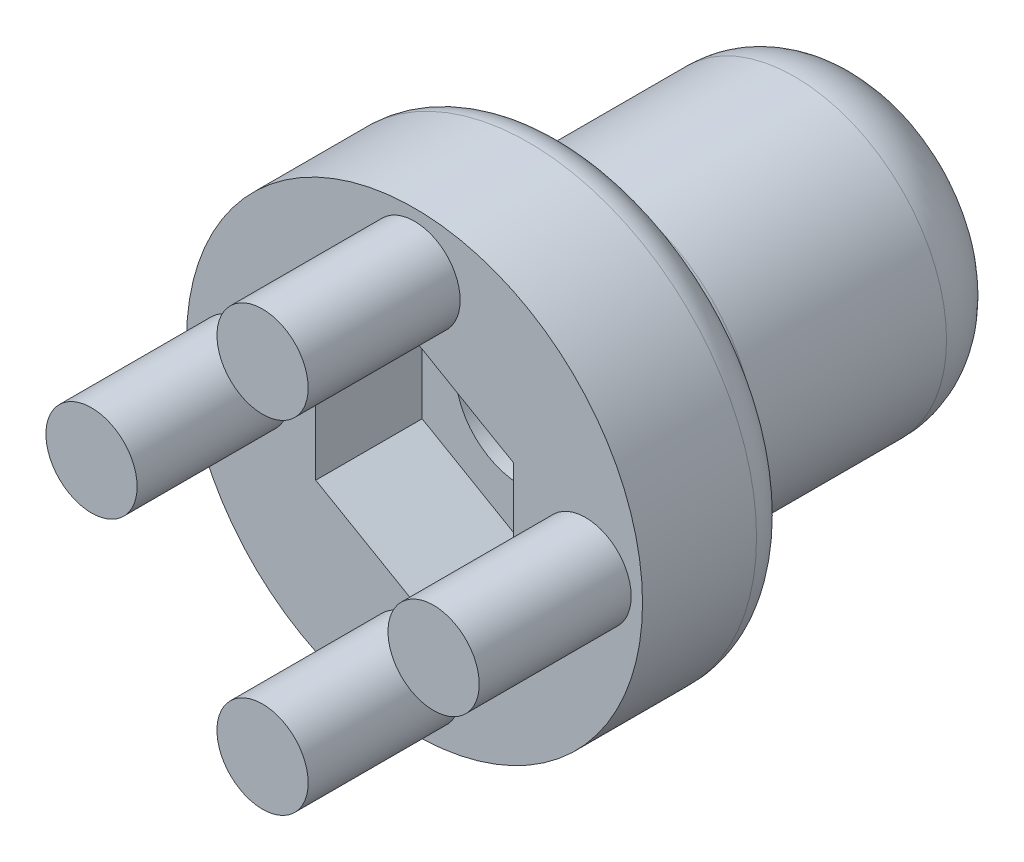
ISO-10303-21;
HEADER;
FILE_DESCRIPTION(('STEP AP214'),'2;1');
FILE_NAME('part.step','',(''),(''),'','','');
FILE_SCHEMA(('AUTOMOTIVE_DESIGN { 1 0 10303 214 1 1 1 1 }'));
ENDSEC;
DATA;
#1=APPLICATION_CONTEXT('core data for automotive mechanical design processes');
#2=APPLICATION_PROTOCOL_DEFINITION('international standard','automotive_design',2000,#1);
#3=PRODUCT_CONTEXT('',#1,'mechanical');
#4=PRODUCT('Part','Part','',(#3));
#5=PRODUCT_RELATED_PRODUCT_CATEGORY('part','',(#4));
#6=PRODUCT_DEFINITION_FORMATION('','',#4);
#7=PRODUCT_DEFINITION_CONTEXT('part definition',#1,'design');
#8=PRODUCT_DEFINITION('design','',#6,#7);
#9=PRODUCT_DEFINITION_SHAPE('','',#8);
#10=(LENGTH_UNIT() NAMED_UNIT(*) SI_UNIT(.MILLI.,.METRE.));
#11=(NAMED_UNIT(*) PLANE_ANGLE_UNIT() SI_UNIT($,.RADIAN.));
#12=(NAMED_UNIT(*) SI_UNIT($,.STERADIAN.) SOLID_ANGLE_UNIT());
#13=UNCERTAINTY_MEASURE_WITH_UNIT(LENGTH_MEASURE(1.E-05),#10,'distance_accuracy_value','');
#14=(GEOMETRIC_REPRESENTATION_CONTEXT(3) GLOBAL_UNCERTAINTY_ASSIGNED_CONTEXT((#13)) GLOBAL_UNIT_ASSIGNED_CONTEXT((#10,
#11,#12)) REPRESENTATION_CONTEXT('',''));
#15=CARTESIAN_POINT('',(0.,0.,0.));
#16=DIRECTION('',(0.,0.,1.));
#17=DIRECTION('',(1.,0.,0.));
#18=AXIS2_PLACEMENT_3D('',#15,#16,#17);
#19=CARTESIAN_POINT('',(0.,0.,30.));
#20=DIRECTION('',(0.,0.,-1.));
#21=DIRECTION('',(-1.,0.,0.));
#22=AXIS2_PLACEMENT_3D('',#19,#20,#21);
#23=CYLINDRICAL_SURFACE('',#22,10.);
#24=CARTESIAN_POINT('',(0.,0.,5.));
#25=DIRECTION('',(0.,0.,1.));
#26=DIRECTION('',(1.,0.,0.));
#27=AXIS2_PLACEMENT_3D('',#24,#25,#26);
#28=CIRCLE('',#27,10.);
#29=CARTESIAN_POINT('',(10.,0.,5.));
#30=VERTEX_POINT('',#29);
#31=EDGE_CURVE('E48',#30,#30,#28,.T.);
#32=ORIENTED_EDGE('',*,*,#31,.T.);
#33=EDGE_LOOP('',(#32));
#34=FACE_BOUND('',#33,.T.);
#35=CARTESIAN_POINT('',(0.,0.,17.5));
#36=DIRECTION('',(0.,0.,1.));
#37=DIRECTION('',(1.,0.,0.));
#38=AXIS2_PLACEMENT_3D('',#35,#36,#37);
#39=CIRCLE('',#38,10.);
#40=CARTESIAN_POINT('',(10.,0.,17.5));
#41=VERTEX_POINT('',#40);
#42=EDGE_CURVE('E157',#41,#41,#39,.F.);
#43=ORIENTED_EDGE('',*,*,#42,.T.);
#44=EDGE_LOOP('',(#43));
#45=FACE_BOUND('',#44,.T.);
#46=ADVANCED_FACE('F40',(#34,#45),#23,.T.);
#47=CARTESIAN_POINT('',(0.,0.,30.));
#48=DIRECTION('',(0.,0.,-1.));
#49=DIRECTION('',(-1.,0.,0.));
#50=AXIS2_PLACEMENT_3D('',#47,#48,#49);
#51=CYLINDRICAL_SURFACE('',#50,4.3);
#52=CARTESIAN_POINT('',(0.,0.,0.));
#53=DIRECTION('',(0.,0.,1.));
#54=DIRECTION('',(1.,0.,0.));
#55=AXIS2_PLACEMENT_3D('',#52,#53,#54);
#56=CIRCLE('',#55,4.3);
#57=CARTESIAN_POINT('',(4.3,0.,0.));
#58=VERTEX_POINT('',#57);
#59=EDGE_CURVE('E149',#58,#58,#56,.T.);
#60=ORIENTED_EDGE('',*,*,#59,.F.);
#61=EDGE_LOOP('',(#60));
#62=FACE_BOUND('',#61,.T.);
#63=CARTESIAN_POINT('',(0.,0.,23.));
#64=DIRECTION('',(0.,0.,1.));
#65=DIRECTION('',(1.,0.,0.));
#66=AXIS2_PLACEMENT_3D('',#63,#64,#65);
#67=CIRCLE('',#66,4.3);
#68=CARTESIAN_POINT('',(4.3,0.,23.));
#69=VERTEX_POINT('',#68);
#70=EDGE_CURVE('E143',#69,#69,#67,.T.);
#71=ORIENTED_EDGE('',*,*,#70,.T.);
#72=EDGE_LOOP('',(#71));
#73=FACE_BOUND('',#72,.T.);
#74=ADVANCED_FACE('F184',(#62,#73),#51,.F.);
#75=CARTESIAN_POINT('',(0.,0.,30.));
#76=DIRECTION('',(0.,0.,1.));
#77=DIRECTION('',(1.,0.,0.));
#78=AXIS2_PLACEMENT_3D('',#75,#76,#77);
#79=PLANE('',#78);
#80=CARTESIAN_POINT('',(6.35053196527873E-13,-11.2527767497326,30.));
#81=DIRECTION('',(0.,0.,1.));
#82=DIRECTION('',(1.,0.,0.));
#83=AXIS2_PLACEMENT_3D('',#80,#81,#82);
#84=CIRCLE('',#83,3.00000000000068);
#85=CARTESIAN_POINT('',(3.00000000000132,-11.2527767497326,30.));
#86=VERTEX_POINT('',#85);
#87=EDGE_CURVE('E251',#86,#86,#84,.T.);
#88=ORIENTED_EDGE('',*,*,#87,.F.);
#89=EDGE_LOOP('',(#88));
#90=FACE_BOUND('',#89,.T.);
#91=CARTESIAN_POINT('',(-11.2527767497323,-3.18675214718788E-13,30.));
#92=DIRECTION('',(0.,0.,1.));
#93=DIRECTION('',(1.,0.,0.));
#94=AXIS2_PLACEMENT_3D('',#91,#92,#93);
#95=CIRCLE('',#94,3.00000000000051);
#96=CARTESIAN_POINT('',(-8.25277674973174,-3.18675214718788E-13,30.));
#97=VERTEX_POINT('',#96);
#98=EDGE_CURVE('E255',#97,#97,#95,.T.);
#99=ORIENTED_EDGE('',*,*,#98,.F.);
#100=EDGE_LOOP('',(#99));
#101=FACE_BOUND('',#100,.T.);
#102=CARTESIAN_POINT('',(0.,11.2527767497326,30.));
#103=DIRECTION('',(0.,0.,1.));
#104=DIRECTION('',(1.,0.,0.));
#105=AXIS2_PLACEMENT_3D('',#102,#103,#104);
#106=CIRCLE('',#105,3.);
#107=CARTESIAN_POINT('',(3.,11.2527767497326,30.));
#108=VERTEX_POINT('',#107);
#109=EDGE_CURVE('E259',#108,#108,#106,.T.);
#110=ORIENTED_EDGE('',*,*,#109,.F.);
#111=EDGE_LOOP('',(#110));
#112=FACE_BOUND('',#111,.T.);
#113=CARTESIAN_POINT('',(11.2527767497329,3.1729714701598E-13,30.));
#114=DIRECTION('',(0.,0.,1.));
#115=DIRECTION('',(1.,0.,0.));
#116=AXIS2_PLACEMENT_3D('',#113,#114,#115);
#117=CIRCLE('',#116,3.00000000000025);
#118=CARTESIAN_POINT('',(14.2527767497331,3.1729714701598E-13,30.));
#119=VERTEX_POINT('',#118);
#120=EDGE_CURVE('E215',#119,#119,#117,.T.);
#121=ORIENTED_EDGE('',*,*,#120,.F.);
#122=EDGE_LOOP('',(#121));
#123=FACE_BOUND('',#122,.T.);
#124=DIRECTION('',(-0.866025403784439,0.5,0.));
#125=VECTOR('',#124,1.);
#126=CARTESIAN_POINT('',(6.5,3.75277674973257,30.));
#127=LINE('',#126,#125);
#128=CARTESIAN_POINT('',(6.5,3.75277674973257,30.));
#129=VERTEX_POINT('',#128);
#130=CARTESIAN_POINT('',(0.,7.50555349946514,30.));
#131=VERTEX_POINT('',#130);
#132=EDGE_CURVE('E55',#129,#131,#127,.T.);
#133=ORIENTED_EDGE('',*,*,#132,.F.);
#134=DIRECTION('',(0.,1.,0.));
#135=VECTOR('',#134,1.);
#136=CARTESIAN_POINT('',(6.5,-3.75277674973257,30.));
#137=LINE('',#136,#135);
#138=CARTESIAN_POINT('',(6.5,-3.75277674973257,30.));
#139=VERTEX_POINT('',#138);
#140=EDGE_CURVE('E139',#139,#129,#137,.T.);
#141=ORIENTED_EDGE('',*,*,#140,.F.);
#142=DIRECTION('',(0.866025403784439,0.5,0.));
#143=VECTOR('',#142,1.);
#144=CARTESIAN_POINT('',(0.,-7.50555349946513,30.));
#145=LINE('',#144,#143);
#146=CARTESIAN_POINT('',(0.,-7.50555349946513,30.));
#147=VERTEX_POINT('',#146);
#148=EDGE_CURVE('E137',#147,#139,#145,.T.);
#149=ORIENTED_EDGE('',*,*,#148,.F.);
#150=DIRECTION('',(0.866025403784439,-0.5,0.));
#151=VECTOR('',#150,1.);
#152=CARTESIAN_POINT('',(-6.5,-3.75277674973257,30.));
#153=LINE('',#152,#151);
#154=CARTESIAN_POINT('',(-6.5,-3.75277674973257,30.));
#155=VERTEX_POINT('',#154);
#156=EDGE_CURVE('E103',#155,#147,#153,.T.);
#157=ORIENTED_EDGE('',*,*,#156,.F.);
#158=DIRECTION('',(0.,-1.,0.));
#159=VECTOR('',#158,1.);
#160=CARTESIAN_POINT('',(-6.5,3.75277674973257,30.));
#161=LINE('',#160,#159);
#162=CARTESIAN_POINT('',(-6.5,3.75277674973257,30.));
#163=VERTEX_POINT('',#162);
#164=EDGE_CURVE('E133',#163,#155,#161,.T.);
#165=ORIENTED_EDGE('',*,*,#164,.F.);
#166=DIRECTION('',(-0.866025403784439,-0.5,0.));
#167=VECTOR('',#166,1.);
#168=CARTESIAN_POINT('',(0.,7.50555349946514,30.));
#169=LINE('',#168,#167);
#170=EDGE_CURVE('E129',#131,#163,#169,.T.);
#171=ORIENTED_EDGE('',*,*,#170,.F.);
#172=EDGE_LOOP('',(#133,#141,#149,#157,#165,#171));
#173=FACE_BOUND('',#172,.T.);
#174=CARTESIAN_POINT('',(0.,0.,30.));
#175=DIRECTION('',(0.,0.,1.));
#176=DIRECTION('',(1.,0.,0.));
#177=AXIS2_PLACEMENT_3D('',#174,#175,#176);
#178=CIRCLE('',#177,15.);
#179=CARTESIAN_POINT('',(15.,0.,30.));
#180=VERTEX_POINT('',#179);
#181=EDGE_CURVE('E130',#180,#180,#178,.T.);
#182=ORIENTED_EDGE('',*,*,#181,.T.);
#183=EDGE_LOOP('',(#182));
#184=FACE_BOUND('',#183,.T.);
#185=ADVANCED_FACE('F189',(#90,#101,#112,#123,#173,#184),#79,.T.);
#186=CARTESIAN_POINT('',(0.,0.,0.));
#187=DIRECTION('',(0.,0.,1.));
#188=DIRECTION('',(1.,0.,0.));
#189=AXIS2_PLACEMENT_3D('',#186,#187,#188);
#190=PLANE('',#189);
#191=CARTESIAN_POINT('',(0.,0.,0.));
#192=DIRECTION('',(0.,0.,1.));
#193=DIRECTION('',(1.,0.,0.));
#194=AXIS2_PLACEMENT_3D('',#191,#192,#193);
#195=CIRCLE('',#194,5.);
#196=CARTESIAN_POINT('',(5.,0.,0.));
#197=VERTEX_POINT('',#196);
#198=EDGE_CURVE('E12',#197,#197,#195,.F.);
#199=ORIENTED_EDGE('',*,*,#198,.T.);
#200=EDGE_LOOP('',(#199));
#201=FACE_BOUND('',#200,.T.);
#202=ORIENTED_EDGE('',*,*,#59,.T.);
#203=EDGE_LOOP('',(#202));
#204=FACE_BOUND('',#203,.T.);
#205=ADVANCED_FACE('F193',(#201,#204),#190,.F.);
#206=CARTESIAN_POINT('',(6.5,3.75277674973257,23.));
#207=DIRECTION('',(0.5,0.866025403784439,0.));
#208=DIRECTION('',(-0.866025403784439,0.5,0.));
#209=AXIS2_PLACEMENT_3D('',#206,#207,#208);
#210=PLANE('',#209);
#211=ORIENTED_EDGE('',*,*,#132,.T.);
#212=DIRECTION('',(0.,0.,1.));
#213=VECTOR('',#212,1.);
#214=CARTESIAN_POINT('',(0.,7.50555349946514,23.));
#215=LINE('',#214,#213);
#216=CARTESIAN_POINT('',(0.,7.50555349946514,23.));
#217=VERTEX_POINT('',#216);
#218=EDGE_CURVE('E85',#217,#131,#215,.T.);
#219=ORIENTED_EDGE('',*,*,#218,.F.);
#220=DIRECTION('',(-0.866025403784439,0.5,0.));
#221=VECTOR('',#220,1.);
#222=CARTESIAN_POINT('',(6.5,3.75277674973257,23.));
#223=LINE('',#222,#221);
#224=CARTESIAN_POINT('',(6.5,3.75277674973257,23.));
#225=VERTEX_POINT('',#224);
#226=EDGE_CURVE('E141',#225,#217,#223,.T.);
#227=ORIENTED_EDGE('',*,*,#226,.F.);
#228=DIRECTION('',(0.,0.,1.));
#229=VECTOR('',#228,1.);
#230=CARTESIAN_POINT('',(6.5,3.75277674973257,23.));
#231=LINE('',#230,#229);
#232=EDGE_CURVE('E63',#225,#129,#231,.T.);
#233=ORIENTED_EDGE('',*,*,#232,.T.);
#234=EDGE_LOOP('',(#211,#219,#227,#233));
#235=FACE_BOUND('',#234,.T.);
#236=ADVANCED_FACE('F227',(#235),#210,.F.);
#237=CARTESIAN_POINT('',(6.5,-3.75277674973257,23.));
#238=DIRECTION('',(1.,0.,0.));
#239=DIRECTION('',(0.,1.,0.));
#240=AXIS2_PLACEMENT_3D('',#237,#238,#239);
#241=PLANE('',#240);
#242=ORIENTED_EDGE('',*,*,#140,.T.);
#243=ORIENTED_EDGE('',*,*,#232,.F.);
#244=DIRECTION('',(0.,1.,0.));
#245=VECTOR('',#244,1.);
#246=CARTESIAN_POINT('',(6.5,-3.75277674973257,23.));
#247=LINE('',#246,#245);
#248=CARTESIAN_POINT('',(6.5,-3.75277674973257,23.));
#249=VERTEX_POINT('',#248);
#250=EDGE_CURVE('E115',#249,#225,#247,.T.);
#251=ORIENTED_EDGE('',*,*,#250,.F.);
#252=DIRECTION('',(0.,0.,1.));
#253=VECTOR('',#252,1.);
#254=CARTESIAN_POINT('',(6.5,-3.75277674973257,23.));
#255=LINE('',#254,#253);
#256=EDGE_CURVE('E107',#249,#139,#255,.T.);
#257=ORIENTED_EDGE('',*,*,#256,.T.);
#258=EDGE_LOOP('',(#242,#243,#251,#257));
#259=FACE_BOUND('',#258,.T.);
#260=ADVANCED_FACE('F225',(#259),#241,.F.);
#261=CARTESIAN_POINT('',(0.,-7.50555349946513,23.));
#262=DIRECTION('',(0.5,-0.866025403784439,0.));
#263=DIRECTION('',(0.866025403784439,0.5,0.));
#264=AXIS2_PLACEMENT_3D('',#261,#262,#263);
#265=PLANE('',#264);
#266=ORIENTED_EDGE('',*,*,#148,.T.);
#267=ORIENTED_EDGE('',*,*,#256,.F.);
#268=DIRECTION('',(0.866025403784439,0.5,0.));
#269=VECTOR('',#268,1.);
#270=CARTESIAN_POINT('',(0.,-7.50555349946513,23.));
#271=LINE('',#270,#269);
#272=CARTESIAN_POINT('',(0.,-7.50555349946513,23.));
#273=VERTEX_POINT('',#272);
#274=EDGE_CURVE('E111',#273,#249,#271,.T.);
#275=ORIENTED_EDGE('',*,*,#274,.F.);
#276=DIRECTION('',(0.,0.,1.));
#277=VECTOR('',#276,1.);
#278=CARTESIAN_POINT('',(0.,-7.50555349946513,23.));
#279=LINE('',#278,#277);
#280=EDGE_CURVE('E96',#273,#147,#279,.T.);
#281=ORIENTED_EDGE('',*,*,#280,.T.);
#282=EDGE_LOOP('',(#266,#267,#275,#281));
#283=FACE_BOUND('',#282,.T.);
#284=ADVANCED_FACE('F112',(#283),#265,.F.);
#285=CARTESIAN_POINT('',(-6.5,-3.75277674973257,23.));
#286=DIRECTION('',(-0.5,-0.866025403784438,0.));
#287=DIRECTION('',(0.866025403784439,-0.5,0.));
#288=AXIS2_PLACEMENT_3D('',#285,#286,#287);
#289=PLANE('',#288);
#290=ORIENTED_EDGE('',*,*,#156,.T.);
#291=ORIENTED_EDGE('',*,*,#280,.F.);
#292=DIRECTION('',(0.866025403784439,-0.5,0.));
#293=VECTOR('',#292,1.);
#294=CARTESIAN_POINT('',(-6.5,-3.75277674973257,23.));
#295=LINE('',#294,#293);
#296=CARTESIAN_POINT('',(-6.5,-3.75277674973257,23.));
#297=VERTEX_POINT('',#296);
#298=EDGE_CURVE('E100',#297,#273,#295,.T.);
#299=ORIENTED_EDGE('',*,*,#298,.F.);
#300=DIRECTION('',(0.,0.,1.));
#301=VECTOR('',#300,1.);
#302=CARTESIAN_POINT('',(-6.5,-3.75277674973257,23.));
#303=LINE('',#302,#301);
#304=EDGE_CURVE('E108',#297,#155,#303,.T.);
#305=ORIENTED_EDGE('',*,*,#304,.T.);
#306=EDGE_LOOP('',(#290,#291,#299,#305));
#307=FACE_BOUND('',#306,.T.);
#308=ADVANCED_FACE('F98',(#307),#289,.F.);
#309=CARTESIAN_POINT('',(-6.5,3.75277674973257,23.));
#310=DIRECTION('',(-1.,0.,0.));
#311=DIRECTION('',(0.,-1.,0.));
#312=AXIS2_PLACEMENT_3D('',#309,#310,#311);
#313=PLANE('',#312);
#314=ORIENTED_EDGE('',*,*,#164,.T.);
#315=ORIENTED_EDGE('',*,*,#304,.F.);
#316=DIRECTION('',(0.,-1.,0.));
#317=VECTOR('',#316,1.);
#318=CARTESIAN_POINT('',(-6.5,3.75277674973257,23.));
#319=LINE('',#318,#317);
#320=CARTESIAN_POINT('',(-6.5,3.75277674973257,23.));
#321=VERTEX_POINT('',#320);
#322=EDGE_CURVE('E121',#321,#297,#319,.T.);
#323=ORIENTED_EDGE('',*,*,#322,.F.);
#324=DIRECTION('',(0.,0.,1.));
#325=VECTOR('',#324,1.);
#326=CARTESIAN_POINT('',(-6.5,3.75277674973257,23.));
#327=LINE('',#326,#325);
#328=EDGE_CURVE('E146',#321,#163,#327,.T.);
#329=ORIENTED_EDGE('',*,*,#328,.T.);
#330=EDGE_LOOP('',(#314,#315,#323,#329));
#331=FACE_BOUND('',#330,.T.);
#332=ADVANCED_FACE('F222',(#331),#313,.F.);
#333=CARTESIAN_POINT('',(0.,7.50555349946514,23.));
#334=DIRECTION('',(-0.5,0.866025403784439,0.));
#335=DIRECTION('',(-0.866025403784439,-0.5,0.));
#336=AXIS2_PLACEMENT_3D('',#333,#334,#335);
#337=PLANE('',#336);
#338=ORIENTED_EDGE('',*,*,#170,.T.);
#339=ORIENTED_EDGE('',*,*,#328,.F.);
#340=DIRECTION('',(-0.866025403784439,-0.5,0.));
#341=VECTOR('',#340,1.);
#342=CARTESIAN_POINT('',(0.,7.50555349946514,23.));
#343=LINE('',#342,#341);
#344=EDGE_CURVE('E123',#217,#321,#343,.T.);
#345=ORIENTED_EDGE('',*,*,#344,.F.);
#346=ORIENTED_EDGE('',*,*,#218,.T.);
#347=EDGE_LOOP('',(#338,#339,#345,#346));
#348=FACE_BOUND('',#347,.T.);
#349=ADVANCED_FACE('F218',(#348),#337,.F.);
#350=CARTESIAN_POINT('',(0.,0.,23.));
#351=DIRECTION('',(0.,0.,1.));
#352=DIRECTION('',(1.,0.,0.));
#353=AXIS2_PLACEMENT_3D('',#350,#351,#352);
#354=PLANE('',#353);
#355=ORIENTED_EDGE('',*,*,#70,.F.);
#356=EDGE_LOOP('',(#355));
#357=FACE_BOUND('',#356,.T.);
#358=ORIENTED_EDGE('',*,*,#226,.T.);
#359=ORIENTED_EDGE('',*,*,#344,.T.);
#360=ORIENTED_EDGE('',*,*,#322,.T.);
#361=ORIENTED_EDGE('',*,*,#298,.T.);
#362=ORIENTED_EDGE('',*,*,#274,.T.);
#363=ORIENTED_EDGE('',*,*,#250,.T.);
#364=EDGE_LOOP('',(#358,#359,#360,#361,#362,#363));
#365=FACE_BOUND('',#364,.T.);
#366=ADVANCED_FACE('F118',(#357,#365),#354,.T.);
#367=CARTESIAN_POINT('',(0.,0.,20.));
#368=DIRECTION('',(0.,0.,1.));
#369=DIRECTION('',(1.,0.,0.));
#370=AXIS2_PLACEMENT_3D('',#367,#368,#369);
#371=CYLINDRICAL_SURFACE('',#370,15.);
#372=CARTESIAN_POINT('',(0.,0.,22.5));
#373=DIRECTION('',(0.,0.,1.));
#374=DIRECTION('',(1.,0.,0.));
#375=AXIS2_PLACEMENT_3D('',#372,#373,#374);
#376=CIRCLE('',#375,15.);
#377=CARTESIAN_POINT('',(15.,0.,22.5));
#378=VERTEX_POINT('',#377);
#379=EDGE_CURVE('E152',#378,#378,#376,.T.);
#380=ORIENTED_EDGE('',*,*,#379,.T.);
#381=EDGE_LOOP('',(#380));
#382=FACE_BOUND('',#381,.T.);
#383=ORIENTED_EDGE('',*,*,#181,.F.);
#384=EDGE_LOOP('',(#383));
#385=FACE_BOUND('',#384,.T.);
#386=ADVANCED_FACE('F196',(#382,#385),#371,.T.);
#387=CARTESIAN_POINT('',(0.,0.,17.5));
#388=DIRECTION('',(0.,0.,1.));
#389=DIRECTION('',(1.,0.,0.));
#390=AXIS2_PLACEMENT_3D('',#387,#388,#389);
#391=TOROIDAL_SURFACE('',#390,12.5,2.5);
#392=ORIENTED_EDGE('',*,*,#42,.F.);
#393=EDGE_LOOP('',(#392));
#394=FACE_BOUND('',#393,.T.);
#395=CARTESIAN_POINT('',(0.,0.,20.));
#396=DIRECTION('',(0.,0.,1.));
#397=DIRECTION('',(1.,0.,0.));
#398=AXIS2_PLACEMENT_3D('',#395,#396,#397);
#399=CIRCLE('',#398,12.5);
#400=CARTESIAN_POINT('',(12.5,0.,20.));
#401=VERTEX_POINT('',#400);
#402=EDGE_CURVE('E160',#401,#401,#399,.T.);
#403=ORIENTED_EDGE('',*,*,#402,.F.);
#404=EDGE_LOOP('',(#403));
#405=FACE_BOUND('',#404,.T.);
#406=ADVANCED_FACE('F179',(#394,#405),#391,.F.);
#407=CARTESIAN_POINT('',(0.,0.,22.5));
#408=DIRECTION('',(0.,0.,1.));
#409=DIRECTION('',(1.,0.,0.));
#410=AXIS2_PLACEMENT_3D('',#407,#408,#409);
#411=TOROIDAL_SURFACE('',#410,12.5,2.5);
#412=ORIENTED_EDGE('',*,*,#402,.T.);
#413=EDGE_LOOP('',(#412));
#414=FACE_BOUND('',#413,.T.);
#415=ORIENTED_EDGE('',*,*,#379,.F.);
#416=EDGE_LOOP('',(#415));
#417=FACE_BOUND('',#416,.T.);
#418=ADVANCED_FACE('F170',(#414,#417),#411,.T.);
#419=CARTESIAN_POINT('',(0.,0.,5.));
#420=DIRECTION('',(0.,0.,1.));
#421=DIRECTION('',(1.,0.,0.));
#422=AXIS2_PLACEMENT_3D('',#419,#420,#421);
#423=DEGENERATE_TOROIDAL_SURFACE('',#422,5.,5.,.T.);
#424=ORIENTED_EDGE('',*,*,#198,.F.);
#425=EDGE_LOOP('',(#424));
#426=FACE_BOUND('',#425,.T.);
#427=ORIENTED_EDGE('',*,*,#31,.F.);
#428=EDGE_LOOP('',(#427));
#429=FACE_BOUND('',#428,.T.);
#430=ADVANCED_FACE('F42',(#426,#429),#423,.T.);
#431=CARTESIAN_POINT('',(11.2527767497329,3.1729714701598E-13,40.));
#432=DIRECTION('',(0.,0.,-1.));
#433=DIRECTION('',(-1.,0.,0.));
#434=AXIS2_PLACEMENT_3D('',#431,#432,#433);
#435=CYLINDRICAL_SURFACE('',#434,3.00000000000025);
#436=CARTESIAN_POINT('',(11.2527767497329,3.1729714701598E-13,40.));
#437=DIRECTION('',(0.,0.,1.));
#438=DIRECTION('',(1.,0.,0.));
#439=AXIS2_PLACEMENT_3D('',#436,#437,#438);
#440=CIRCLE('',#439,3.00000000000025);
#441=CARTESIAN_POINT('',(14.2527767497331,3.1729714701598E-13,40.));
#442=VERTEX_POINT('',#441);
#443=EDGE_CURVE('E162',#442,#442,#440,.T.);
#444=ORIENTED_EDGE('',*,*,#443,.F.);
#445=EDGE_LOOP('',(#444));
#446=FACE_BOUND('',#445,.T.);
#447=ORIENTED_EDGE('',*,*,#120,.T.);
#448=EDGE_LOOP('',(#447));
#449=FACE_BOUND('',#448,.T.);
#450=ADVANCED_FACE('F169',(#446,#449),#435,.T.);
#451=CARTESIAN_POINT('',(0.,0.,40.));
#452=DIRECTION('',(0.,0.,1.));
#453=DIRECTION('',(1.,0.,0.));
#454=AXIS2_PLACEMENT_3D('',#451,#452,#453);
#455=PLANE('',#454);
#456=ORIENTED_EDGE('',*,*,#443,.T.);
#457=EDGE_LOOP('',(#456));
#458=FACE_BOUND('',#457,.T.);
#459=ADVANCED_FACE('F176',(#458),#455,.T.);
#460=CARTESIAN_POINT('',(0.,11.2527767497326,40.));
#461=DIRECTION('',(0.,0.,-1.));
#462=DIRECTION('',(-1.,0.,0.));
#463=AXIS2_PLACEMENT_3D('',#460,#461,#462);
#464=CYLINDRICAL_SURFACE('',#463,3.);
#465=CARTESIAN_POINT('',(0.,11.2527767497326,40.));
#466=DIRECTION('',(0.,0.,1.));
#467=DIRECTION('',(1.,0.,0.));
#468=AXIS2_PLACEMENT_3D('',#465,#466,#467);
#469=CIRCLE('',#468,3.);
#470=CARTESIAN_POINT('',(3.,11.2527767497326,40.));
#471=VERTEX_POINT('',#470);
#472=EDGE_CURVE('E263',#471,#471,#469,.T.);
#473=ORIENTED_EDGE('',*,*,#472,.F.);
#474=EDGE_LOOP('',(#473));
#475=FACE_BOUND('',#474,.T.);
#476=ORIENTED_EDGE('',*,*,#109,.T.);
#477=EDGE_LOOP('',(#476));
#478=FACE_BOUND('',#477,.T.);
#479=ADVANCED_FACE('F302',(#475,#478),#464,.T.);
#480=CARTESIAN_POINT('',(0.,0.,40.));
#481=DIRECTION('',(0.,0.,1.));
#482=DIRECTION('',(1.,0.,0.));
#483=AXIS2_PLACEMENT_3D('',#480,#481,#482);
#484=PLANE('',#483);
#485=ORIENTED_EDGE('',*,*,#472,.T.);
#486=EDGE_LOOP('',(#485));
#487=FACE_BOUND('',#486,.T.);
#488=ADVANCED_FACE('F298',(#487),#484,.T.);
#489=CARTESIAN_POINT('',(-11.2527767497323,-3.18675214718788E-13,40.));
#490=DIRECTION('',(0.,0.,-1.));
#491=DIRECTION('',(-1.,0.,0.));
#492=AXIS2_PLACEMENT_3D('',#489,#490,#491);
#493=CYLINDRICAL_SURFACE('',#492,3.00000000000051);
#494=CARTESIAN_POINT('',(-11.2527767497323,-3.18675214718788E-13,40.));
#495=DIRECTION('',(0.,0.,1.));
#496=DIRECTION('',(1.,0.,0.));
#497=AXIS2_PLACEMENT_3D('',#494,#495,#496);
#498=CIRCLE('',#497,3.00000000000051);
#499=CARTESIAN_POINT('',(-8.25277674973174,-3.18675214718788E-13,40.));
#500=VERTEX_POINT('',#499);
#501=EDGE_CURVE('E269',#500,#500,#498,.T.);
#502=ORIENTED_EDGE('',*,*,#501,.F.);
#503=EDGE_LOOP('',(#502));
#504=FACE_BOUND('',#503,.T.);
#505=ORIENTED_EDGE('',*,*,#98,.T.);
#506=EDGE_LOOP('',(#505));
#507=FACE_BOUND('',#506,.T.);
#508=ADVANCED_FACE('F292',(#504,#507),#493,.T.);
#509=CARTESIAN_POINT('',(0.,0.,40.));
#510=DIRECTION('',(0.,0.,1.));
#511=DIRECTION('',(1.,0.,0.));
#512=AXIS2_PLACEMENT_3D('',#509,#510,#511);
#513=PLANE('',#512);
#514=ORIENTED_EDGE('',*,*,#501,.T.);
#515=EDGE_LOOP('',(#514));
#516=FACE_BOUND('',#515,.T.);
#517=ADVANCED_FACE('F285',(#516),#513,.T.);
#518=CARTESIAN_POINT('',(6.35053196527873E-13,-11.2527767497326,40.));
#519=DIRECTION('',(0.,0.,-1.));
#520=DIRECTION('',(-1.,0.,0.));
#521=AXIS2_PLACEMENT_3D('',#518,#519,#520);
#522=CYLINDRICAL_SURFACE('',#521,3.00000000000068);
#523=CARTESIAN_POINT('',(6.35053196527873E-13,-11.2527767497326,40.));
#524=DIRECTION('',(0.,0.,1.));
#525=DIRECTION('',(1.,0.,0.));
#526=AXIS2_PLACEMENT_3D('',#523,#524,#525);
#527=CIRCLE('',#526,3.00000000000068);
#528=CARTESIAN_POINT('',(3.00000000000132,-11.2527767497326,40.));
#529=VERTEX_POINT('',#528);
#530=EDGE_CURVE('E273',#529,#529,#527,.T.);
#531=ORIENTED_EDGE('',*,*,#530,.F.);
#532=EDGE_LOOP('',(#531));
#533=FACE_BOUND('',#532,.T.);
#534=ORIENTED_EDGE('',*,*,#87,.T.);
#535=EDGE_LOOP('',(#534));
#536=FACE_BOUND('',#535,.T.);
#537=ADVANCED_FACE('F282',(#533,#536),#522,.T.);
#538=CARTESIAN_POINT('',(0.,0.,40.));
#539=DIRECTION('',(0.,0.,1.));
#540=DIRECTION('',(1.,0.,0.));
#541=AXIS2_PLACEMENT_3D('',#538,#539,#540);
#542=PLANE('',#541);
#543=ORIENTED_EDGE('',*,*,#530,.T.);
#544=EDGE_LOOP('',(#543));
#545=FACE_BOUND('',#544,.T.);
#546=ADVANCED_FACE('F280',(#545),#542,.T.);
#547=CLOSED_SHELL('',(#46,#74,#185,#205,#236,#260,#284,#308,#332,#349,#366,#386,#406,#418,#430,
#450,#459,#479,#488,#508,#517,#537,#546));
#548=MANIFOLD_SOLID_BREP('B2',#547);
#549=ADVANCED_BREP_SHAPE_REPRESENTATION('',(#18,#548),#14);
#550=SHAPE_DEFINITION_REPRESENTATION(#9,#549);
ENDSEC;
END-ISO-10303-21;
